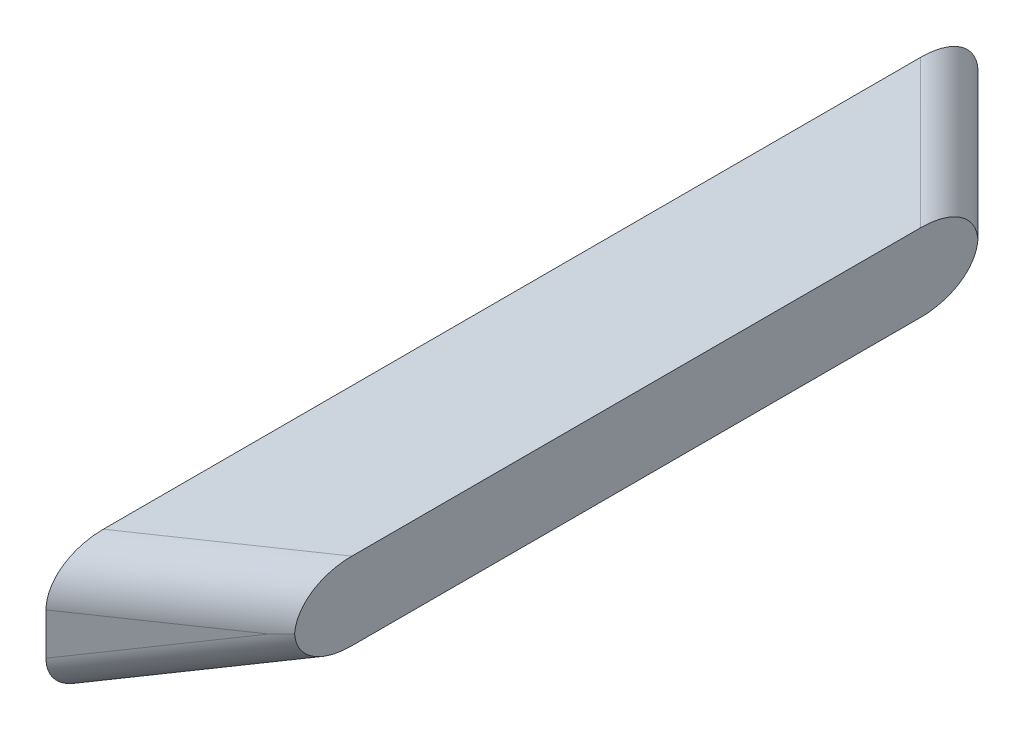
ISO-10303-21;
HEADER;
FILE_DESCRIPTION(('STEP AP214'),'2;1');
FILE_NAME('part.step','',(''),(''),'','','');
FILE_SCHEMA(('AUTOMOTIVE_DESIGN { 1 0 10303 214 1 1 1 1 }'));
ENDSEC;
DATA;
#1=APPLICATION_CONTEXT('core data for automotive mechanical design processes');
#2=APPLICATION_PROTOCOL_DEFINITION('international standard','automotive_design',2000,#1);
#3=PRODUCT_CONTEXT('',#1,'mechanical');
#4=PRODUCT('Part','Part','',(#3));
#5=PRODUCT_RELATED_PRODUCT_CATEGORY('part','',(#4));
#6=PRODUCT_DEFINITION_FORMATION('','',#4);
#7=PRODUCT_DEFINITION_CONTEXT('part definition',#1,'design');
#8=PRODUCT_DEFINITION('design','',#6,#7);
#9=PRODUCT_DEFINITION_SHAPE('','',#8);
#10=(LENGTH_UNIT() NAMED_UNIT(*) SI_UNIT(.MILLI.,.METRE.));
#11=(NAMED_UNIT(*) PLANE_ANGLE_UNIT() SI_UNIT($,.RADIAN.));
#12=(NAMED_UNIT(*) SI_UNIT($,.STERADIAN.) SOLID_ANGLE_UNIT());
#13=UNCERTAINTY_MEASURE_WITH_UNIT(LENGTH_MEASURE(1.E-05),#10,'distance_accuracy_value','');
#14=(GEOMETRIC_REPRESENTATION_CONTEXT(3) GLOBAL_UNCERTAINTY_ASSIGNED_CONTEXT((#13)) GLOBAL_UNIT_ASSIGNED_CONTEXT((#10,
#11,#12)) REPRESENTATION_CONTEXT('',''));
#15=CARTESIAN_POINT('',(0.,0.,0.));
#16=DIRECTION('',(0.,0.,1.));
#17=DIRECTION('',(1.,0.,0.));
#18=AXIS2_PLACEMENT_3D('',#15,#16,#17);
#19=CARTESIAN_POINT('',(-18.7232000443977,19.7306031563211,30.));
#20=DIRECTION('',(-0.184288535050185,-0.982872186934322,0.));
#21=DIRECTION('',(0.982872186934322,-0.184288535050185,0.));
#22=AXIS2_PLACEMENT_3D('',#19,#20,#21);
#23=PLANE('',#22);
#24=DIRECTION('',(0.,0.,-1.));
#25=VECTOR('',#24,1.);
#26=CARTESIAN_POINT('',(-14.7232000443977,18.9806031563211,30.));
#27=LINE('',#26,#25);
#28=CARTESIAN_POINT('',(-14.7232000443977,18.9806031563211,24.1551124590156));
#29=VERTEX_POINT('',#28);
#30=CARTESIAN_POINT('',(-14.7232000443977,18.9806031563211,5.84488754098436));
#31=VERTEX_POINT('',#30);
#32=EDGE_CURVE('E141',#29,#31,#27,.T.);
#33=ORIENTED_EDGE('',*,*,#32,.T.);
#34=DIRECTION('',(-0.700972726941318,0.131432386301497,-0.700972726941318));
#35=VECTOR('',#34,1.);
#36=CARTESIAN_POINT('',(-4.88882616818273,17.1366580545308,15.6792614171993));
#37=LINE('',#36,#35);
#38=CARTESIAN_POINT('',(-18.7232000443977,19.7306031563211,1.84488754098436));
#39=VERTEX_POINT('',#38);
#40=EDGE_CURVE('E168',#31,#39,#37,.T.);
#41=ORIENTED_EDGE('',*,*,#40,.T.);
#42=DIRECTION('',(0.,0.,-1.));
#43=VECTOR('',#42,1.);
#44=CARTESIAN_POINT('',(-18.7232000443977,19.7306031563211,30.));
#45=LINE('',#44,#43);
#46=CARTESIAN_POINT('',(-18.7232000443977,19.7306031563211,28.1551124590156));
#47=VERTEX_POINT('',#46);
#48=EDGE_CURVE('E150',#47,#39,#45,.T.);
#49=ORIENTED_EDGE('',*,*,#48,.F.);
#50=DIRECTION('',(0.700972726941318,-0.131432386301497,-0.700972726941318));
#51=VECTOR('',#50,1.);
#52=CARTESIAN_POINT('',(-19.6297090856491,19.9005736015558,29.0616215002671));
#53=LINE('',#52,#51);
#54=EDGE_CURVE('E166',#47,#29,#53,.T.);
#55=ORIENTED_EDGE('',*,*,#54,.T.);
#56=EDGE_LOOP('',(#33,#41,#49,#55));
#57=FACE_BOUND('',#56,.T.);
#58=ADVANCED_FACE('F43',(#57),#23,.F.);
#59=CARTESIAN_POINT('',(-18.7232000443977,15.7306031563211,30.));
#60=DIRECTION('',(1.,0.,0.));
#61=DIRECTION('',(0.,0.,-1.));
#62=AXIS2_PLACEMENT_3D('',#59,#60,#61);
#63=PLANE('',#62);
#64=DIRECTION('',(0.,1.,0.));
#65=VECTOR('',#64,1.);
#66=CARTESIAN_POINT('',(-18.7232000443977,10.3994599232696,0.));
#67=LINE('',#66,#65);
#68=CARTESIAN_POINT('',(-18.7232000443977,17.0578688049968,0.));
#69=VERTEX_POINT('',#68);
#70=CARTESIAN_POINT('',(-18.7232000443977,18.4033375076455,0.));
#71=VERTEX_POINT('',#70);
#72=EDGE_CURVE('E128',#69,#71,#67,.T.);
#73=ORIENTED_EDGE('',*,*,#72,.F.);
#74=CARTESIAN_POINT('',(-18.7232000443977,17.2567425872055,2.12132034355964));
#75=DIRECTION('',(1.,0.,0.));
#76=DIRECTION('',(0.,-0.184288535050185,-0.982872186934322));
#77=AXIS2_PLACEMENT_3D('',#74,#75,#76);
#78=ELLIPSE('',#77,2.13988353947125,1.5);
#79=CARTESIAN_POINT('',(-18.7232000443977,15.7306031563211,1.84488754098437));
#80=VERTEX_POINT('',#79);
#81=EDGE_CURVE('E112',#69,#80,#78,.F.);
#82=ORIENTED_EDGE('',*,*,#81,.T.);
#83=DIRECTION('',(0.,0.,-1.));
#84=VECTOR('',#83,1.);
#85=CARTESIAN_POINT('',(-18.7232000443977,15.7306031563211,30.));
#86=LINE('',#85,#84);
#87=CARTESIAN_POINT('',(-18.7232000443977,15.7306031563211,28.1551124590156));
#88=VERTEX_POINT('',#87);
#89=EDGE_CURVE('E148',#88,#80,#86,.T.);
#90=ORIENTED_EDGE('',*,*,#89,.F.);
#91=CARTESIAN_POINT('',(-18.7232000443977,17.2567425872055,27.8786796564404));
#92=DIRECTION('',(1.,0.,0.));
#93=DIRECTION('',(0.,0.184288535050185,-0.982872186934322));
#94=AXIS2_PLACEMENT_3D('',#91,#92,#93);
#95=ELLIPSE('',#94,2.13988353947125,1.5);
#96=CARTESIAN_POINT('',(-18.7232000443977,17.0578688049968,30.));
#97=VERTEX_POINT('',#96);
#98=EDGE_CURVE('E154',#88,#97,#95,.F.);
#99=ORIENTED_EDGE('',*,*,#98,.T.);
#100=DIRECTION('',(0.,1.,0.));
#101=VECTOR('',#100,1.);
#102=CARTESIAN_POINT('',(-18.7232000443977,10.3994599232696,30.));
#103=LINE('',#102,#101);
#104=CARTESIAN_POINT('',(-18.7232000443977,18.4033375076455,30.));
#105=VERTEX_POINT('',#104);
#106=EDGE_CURVE('E137',#97,#105,#103,.T.);
#107=ORIENTED_EDGE('',*,*,#106,.T.);
#108=CARTESIAN_POINT('',(-18.7232000443977,18.2044637254368,27.8786796564404));
#109=DIRECTION('',(1.,0.,0.));
#110=DIRECTION('',(0.,-0.184288535050185,-0.982872186934322));
#111=AXIS2_PLACEMENT_3D('',#108,#109,#110);
#112=ELLIPSE('',#111,2.13988353947125,1.5);
#113=EDGE_CURVE('E132',#105,#47,#112,.F.);
#114=ORIENTED_EDGE('',*,*,#113,.T.);
#115=ORIENTED_EDGE('',*,*,#48,.T.);
#116=CARTESIAN_POINT('',(-18.7232000443977,18.2044637254368,2.12132034355964));
#117=DIRECTION('',(1.,0.,0.));
#118=DIRECTION('',(0.,0.184288535050185,-0.982872186934322));
#119=AXIS2_PLACEMENT_3D('',#116,#117,#118);
#120=ELLIPSE('',#119,2.13988353947125,1.5);
#121=EDGE_CURVE('E123',#39,#71,#120,.F.);
#122=ORIENTED_EDGE('',*,*,#121,.T.);
#123=EDGE_LOOP('',(#73,#82,#90,#99,#107,#114,#115,#122));
#124=FACE_BOUND('',#123,.T.);
#125=ADVANCED_FACE('F134',(#124),#63,.F.);
#126=CARTESIAN_POINT('',(-18.7232000443977,15.7306031563211,30.));
#127=DIRECTION('',(-0.184288535050185,0.982872186934322,0.));
#128=DIRECTION('',(-0.982872186934322,-0.184288535050185,0.));
#129=AXIS2_PLACEMENT_3D('',#126,#127,#128);
#130=PLANE('',#129);
#131=ORIENTED_EDGE('',*,*,#89,.T.);
#132=DIRECTION('',(-0.700972726941318,-0.131432386301497,-0.700972726941318));
#133=VECTOR('',#132,1.);
#134=CARTESIAN_POINT('',(-4.88882616818273,18.3245482581114,15.6792614171993));
#135=LINE('',#134,#133);
#136=CARTESIAN_POINT('',(-14.7232000443977,16.4806031563211,5.84488754098437));
#137=VERTEX_POINT('',#136);
#138=EDGE_CURVE('E117',#80,#137,#135,.F.);
#139=ORIENTED_EDGE('',*,*,#138,.T.);
#140=DIRECTION('',(0.,0.,-1.));
#141=VECTOR('',#140,1.);
#142=CARTESIAN_POINT('',(-14.7232000443977,16.4806031563211,30.));
#143=LINE('',#142,#141);
#144=CARTESIAN_POINT('',(-14.7232000443977,16.4806031563211,24.1551124590156));
#145=VERTEX_POINT('',#144);
#146=EDGE_CURVE('E146',#145,#137,#143,.T.);
#147=ORIENTED_EDGE('',*,*,#146,.F.);
#148=DIRECTION('',(0.700972726941318,0.131432386301497,-0.700972726941318));
#149=VECTOR('',#148,1.);
#150=CARTESIAN_POINT('',(-19.6297090856491,15.5606327110865,29.0616215002671));
#151=LINE('',#150,#149);
#152=EDGE_CURVE('E122',#145,#88,#151,.F.);
#153=ORIENTED_EDGE('',*,*,#152,.T.);
#154=EDGE_LOOP('',(#131,#139,#147,#153));
#155=FACE_BOUND('',#154,.T.);
#156=ADVANCED_FACE('F198',(#155),#130,.F.);
#157=CARTESIAN_POINT('',(-14.7232000443977,18.9806031563211,30.));
#158=DIRECTION('',(-1.,0.,0.));
#159=DIRECTION('',(0.,0.,1.));
#160=AXIS2_PLACEMENT_3D('',#157,#158,#159);
#161=PLANE('',#160);
#162=ORIENTED_EDGE('',*,*,#146,.T.);
#163=CARTESIAN_POINT('',(-14.7232000443977,18.0067425872055,6.12132034355964));
#164=DIRECTION('',(-1.,0.,0.));
#165=DIRECTION('',(0.,-0.184288535050185,-0.982872186934322));
#166=AXIS2_PLACEMENT_3D('',#163,#164,#165);
#167=ELLIPSE('',#166,2.13988353947125,1.5);
#168=CARTESIAN_POINT('',(-14.7232000443977,17.7306031563211,4.00278622149579));
#169=VERTEX_POINT('',#168);
#170=EDGE_CURVE('E67',#137,#169,#167,.F.);
#171=ORIENTED_EDGE('',*,*,#170,.T.);
#172=CARTESIAN_POINT('',(-14.7232000443977,17.4544637254368,6.12132034355964));
#173=DIRECTION('',(-1.,0.,0.));
#174=DIRECTION('',(0.,0.184288535050185,-0.982872186934322));
#175=AXIS2_PLACEMENT_3D('',#172,#173,#174);
#176=ELLIPSE('',#175,2.13988353947125,1.5);
#177=EDGE_CURVE('E163',#169,#31,#176,.F.);
#178=ORIENTED_EDGE('',*,*,#177,.T.);
#179=ORIENTED_EDGE('',*,*,#32,.F.);
#180=CARTESIAN_POINT('',(-14.7232000443977,17.4544637254368,23.8786796564404));
#181=DIRECTION('',(-1.,0.,0.));
#182=DIRECTION('',(0.,-0.184288535050185,-0.982872186934322));
#183=AXIS2_PLACEMENT_3D('',#180,#181,#182);
#184=ELLIPSE('',#183,2.13988353947125,1.5);
#185=CARTESIAN_POINT('',(-14.7232000443977,17.7306031563211,25.9972137785042));
#186=VERTEX_POINT('',#185);
#187=EDGE_CURVE('E159',#29,#186,#184,.F.);
#188=ORIENTED_EDGE('',*,*,#187,.T.);
#189=CARTESIAN_POINT('',(-14.7232000443977,18.0067425872055,23.8786796564404));
#190=DIRECTION('',(-1.,0.,0.));
#191=DIRECTION('',(0.,0.184288535050185,-0.982872186934322));
#192=AXIS2_PLACEMENT_3D('',#189,#190,#191);
#193=ELLIPSE('',#192,2.13988353947125,1.5);
#194=EDGE_CURVE('E161',#186,#145,#193,.F.);
#195=ORIENTED_EDGE('',*,*,#194,.T.);
#196=EDGE_LOOP('',(#162,#171,#178,#179,#188,#195));
#197=FACE_BOUND('',#196,.T.);
#198=ADVANCED_FACE('F182',(#197),#161,.F.);
#199=CARTESIAN_POINT('',(-14.7232000443977,10.3994599232696,4.));
#200=DIRECTION('',(-0.707106781186547,0.,0.707106781186547));
#201=DIRECTION('',(0.707106781186548,0.,0.707106781186548));
#202=AXIS2_PLACEMENT_3D('',#199,#200,#201);
#203=PLANE('',#202);
#204=DIRECTION('',(-0.700972726941318,0.131432386301497,-0.700972726941318));
#205=VECTOR('',#204,1.);
#206=CARTESIAN_POINT('',(-14.054896543342,17.5280306011975,4.66830350105575));
#207=LINE('',#206,#205);
#208=CARTESIAN_POINT('',(-15.1352835040011,17.7306031563211,3.58791654039664));
#209=VERTEX_POINT('',#208);
#210=EDGE_CURVE('E130',#71,#209,#207,.F.);
#211=ORIENTED_EDGE('',*,*,#210,.T.);
#212=DIRECTION('',(-0.700972726941318,-0.131432386301497,-0.700972726941318));
#213=VECTOR('',#212,1.);
#214=CARTESIAN_POINT('',(-15.4057405939618,17.6798924519535,3.31745945043589));
#215=LINE('',#214,#213);
#216=EDGE_CURVE('E116',#209,#69,#215,.T.);
#217=ORIENTED_EDGE('',*,*,#216,.T.);
#218=ORIENTED_EDGE('',*,*,#72,.T.);
#219=EDGE_LOOP('',(#211,#217,#218));
#220=FACE_BOUND('',#219,.T.);
#221=ADVANCED_FACE('F127',(#220),#203,.F.);
#222=CARTESIAN_POINT('',(-14.7232000443977,10.3994599232696,26.));
#223=DIRECTION('',(-0.707106781186547,0.,-0.707106781186547));
#224=DIRECTION('',(-0.707106781186548,0.,0.707106781186548));
#225=AXIS2_PLACEMENT_3D('',#222,#223,#224);
#226=PLANE('',#225);
#227=ORIENTED_EDGE('',*,*,#106,.F.);
#228=DIRECTION('',(0.700972726941318,0.131432386301497,-0.700972726941318));
#229=VECTOR('',#228,1.);
#230=CARTESIAN_POINT('',(-15.4057405939618,17.6798924519535,26.6825405495641));
#231=LINE('',#230,#229);
#232=CARTESIAN_POINT('',(-15.1352835040011,17.7306031563211,26.4120834596034));
#233=VERTEX_POINT('',#232);
#234=EDGE_CURVE('E11',#97,#233,#231,.T.);
#235=ORIENTED_EDGE('',*,*,#234,.T.);
#236=DIRECTION('',(0.700972726941318,-0.131432386301497,-0.700972726941318));
#237=VECTOR('',#236,1.);
#238=CARTESIAN_POINT('',(-14.054896543342,17.5280306011975,25.3316964989443));
#239=LINE('',#238,#237);
#240=EDGE_CURVE('E52',#233,#105,#239,.F.);
#241=ORIENTED_EDGE('',*,*,#240,.T.);
#242=EDGE_LOOP('',(#227,#235,#241));
#243=FACE_BOUND('',#242,.T.);
#244=ADVANCED_FACE('F172',(#243),#226,.F.);
#245=CARTESIAN_POINT('',(-5.16525897075801,15.6623497741293,15.6792614171993));
#246=DIRECTION('',(-0.700972726941318,0.131432386301497,-0.700972726941318));
#247=DIRECTION('',(-0.707106781186548,0.,0.707106781186548));
#248=AXIS2_PLACEMENT_3D('',#245,#246,#247);
#249=CYLINDRICAL_SURFACE('',#248,1.5);
#250=ORIENTED_EDGE('',*,*,#40,.F.);
#251=ORIENTED_EDGE('',*,*,#177,.F.);
#252=CARTESIAN_POINT('',(-16.1959436757809,17.7306031563211,4.64857671217644));
#253=DIRECTION('',(0.,-1.,0.));
#254=DIRECTION('',(-0.707106781186548,0.,-0.707106781186548));
#255=AXIS2_PLACEMENT_3D('',#252,#253,#254);
#256=ELLIPSE('',#255,11.4127122105133,1.5);
#257=EDGE_CURVE('E138',#209,#169,#256,.T.);
#258=ORIENTED_EDGE('',*,*,#257,.F.);
#259=ORIENTED_EDGE('',*,*,#210,.F.);
#260=ORIENTED_EDGE('',*,*,#121,.F.);
#261=EDGE_LOOP('',(#250,#251,#258,#259,#260));
#262=FACE_BOUND('',#261,.T.);
#263=ADVANCED_FACE('F184',(#262),#249,.T.);
#264=CARTESIAN_POINT('',(-16.4664007657416,17.6798924519535,4.37811962221571));
#265=DIRECTION('',(-0.700972726941318,-0.131432386301497,-0.700972726941318));
#266=DIRECTION('',(-0.707106781186548,0.,0.707106781186548));
#267=AXIS2_PLACEMENT_3D('',#264,#265,#266);
#268=CYLINDRICAL_SURFACE('',#267,1.5);
#269=ORIENTED_EDGE('',*,*,#170,.F.);
#270=ORIENTED_EDGE('',*,*,#138,.F.);
#271=ORIENTED_EDGE('',*,*,#81,.F.);
#272=ORIENTED_EDGE('',*,*,#216,.F.);
#273=ORIENTED_EDGE('',*,*,#257,.T.);
#274=EDGE_LOOP('',(#269,#270,#271,#272,#273));
#275=FACE_BOUND('',#274,.T.);
#276=ADVANCED_FACE('F114',(#275),#268,.T.);
#277=CARTESIAN_POINT('',(-19.9061418882244,18.4262653211543,29.0616215002671));
#278=DIRECTION('',(0.700972726941318,-0.131432386301497,-0.700972726941318));
#279=DIRECTION('',(-0.707106781186548,0.,-0.707106781186548));
#280=AXIS2_PLACEMENT_3D('',#277,#278,#279);
#281=CYLINDRICAL_SURFACE('',#280,1.5);
#282=ORIENTED_EDGE('',*,*,#113,.F.);
#283=ORIENTED_EDGE('',*,*,#240,.F.);
#284=CARTESIAN_POINT('',(-16.1959436757809,17.7306031563211,25.3514232878235));
#285=DIRECTION('',(0.,-1.,0.));
#286=DIRECTION('',(0.707106781186548,0.,-0.707106781186548));
#287=AXIS2_PLACEMENT_3D('',#284,#285,#286);
#288=ELLIPSE('',#287,11.4127122105133,1.5);
#289=EDGE_CURVE('E47',#186,#233,#288,.T.);
#290=ORIENTED_EDGE('',*,*,#289,.F.);
#291=ORIENTED_EDGE('',*,*,#187,.F.);
#292=ORIENTED_EDGE('',*,*,#54,.F.);
#293=EDGE_LOOP('',(#282,#283,#290,#291,#292));
#294=FACE_BOUND('',#293,.T.);
#295=ADVANCED_FACE('F45',(#294),#281,.T.);
#296=CARTESIAN_POINT('',(-16.4664007657416,17.6798924519535,25.6218803777843));
#297=DIRECTION('',(0.700972726941318,0.131432386301497,-0.700972726941318));
#298=DIRECTION('',(-0.707106781186548,0.,-0.707106781186548));
#299=AXIS2_PLACEMENT_3D('',#296,#297,#298);
#300=CYLINDRICAL_SURFACE('',#299,1.5);
#301=ORIENTED_EDGE('',*,*,#98,.F.);
#302=ORIENTED_EDGE('',*,*,#152,.F.);
#303=ORIENTED_EDGE('',*,*,#194,.F.);
#304=ORIENTED_EDGE('',*,*,#289,.T.);
#305=ORIENTED_EDGE('',*,*,#234,.F.);
#306=EDGE_LOOP('',(#301,#302,#303,#304,#305));
#307=FACE_BOUND('',#306,.T.);
#308=ADVANCED_FACE('F238',(#307),#300,.T.);
#309=CLOSED_SHELL('',(#58,#125,#156,#198,#221,#244,#263,#276,#295,#308));
#310=MANIFOLD_SOLID_BREP('B2',#309);
#311=ADVANCED_BREP_SHAPE_REPRESENTATION('',(#18,#310),#14);
#312=SHAPE_DEFINITION_REPRESENTATION(#9,#311);
ENDSEC;
END-ISO-10303-21;
